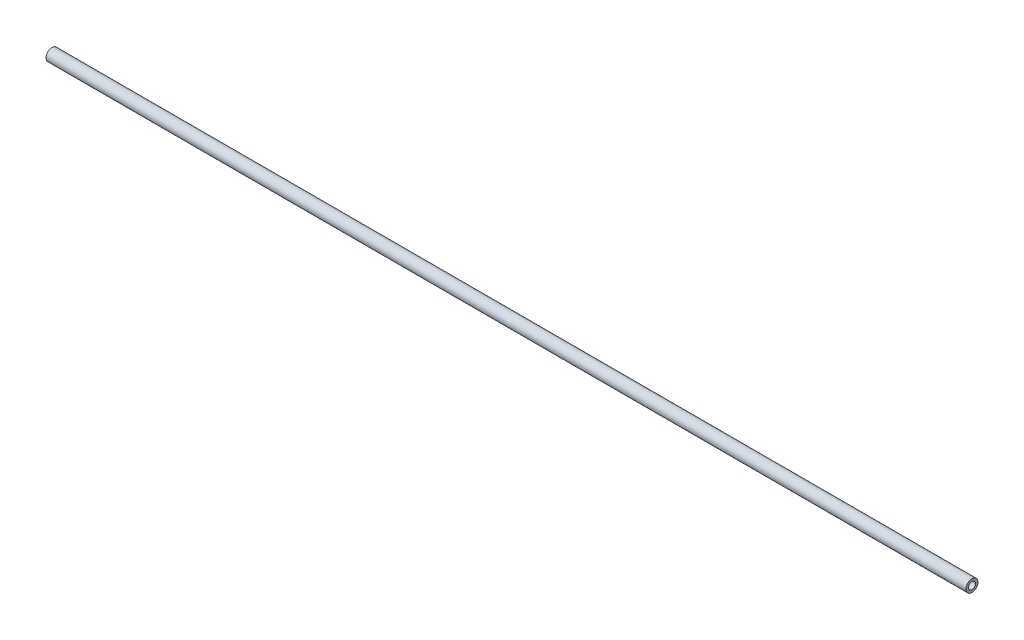
ISO-10303-21;
HEADER;
FILE_DESCRIPTION(('STEP AP214'),'2;1');
FILE_NAME('part.step','',(''),(''),'','','');
FILE_SCHEMA(('AUTOMOTIVE_DESIGN { 1 0 10303 214 1 1 1 1 }'));
ENDSEC;
DATA;
#1=APPLICATION_CONTEXT('core data for automotive mechanical design processes');
#2=APPLICATION_PROTOCOL_DEFINITION('international standard','automotive_design',2000,#1);
#3=PRODUCT_CONTEXT('',#1,'mechanical');
#4=PRODUCT('Part','Part','',(#3));
#5=PRODUCT_RELATED_PRODUCT_CATEGORY('part','',(#4));
#6=PRODUCT_DEFINITION_FORMATION('','',#4);
#7=PRODUCT_DEFINITION_CONTEXT('part definition',#1,'design');
#8=PRODUCT_DEFINITION('design','',#6,#7);
#9=PRODUCT_DEFINITION_SHAPE('','',#8);
#10=(LENGTH_UNIT() NAMED_UNIT(*) SI_UNIT(.MILLI.,.METRE.));
#11=(NAMED_UNIT(*) PLANE_ANGLE_UNIT() SI_UNIT($,.RADIAN.));
#12=(NAMED_UNIT(*) SI_UNIT($,.STERADIAN.) SOLID_ANGLE_UNIT());
#13=UNCERTAINTY_MEASURE_WITH_UNIT(LENGTH_MEASURE(1.E-05),#10,'distance_accuracy_value','');
#14=(GEOMETRIC_REPRESENTATION_CONTEXT(3) GLOBAL_UNCERTAINTY_ASSIGNED_CONTEXT((#13)) GLOBAL_UNIT_ASSIGNED_CONTEXT((#10,
#11,#12)) REPRESENTATION_CONTEXT('',''));
#15=CARTESIAN_POINT('',(0.,0.,0.));
#16=DIRECTION('',(0.,0.,1.));
#17=DIRECTION('',(1.,0.,0.));
#18=AXIS2_PLACEMENT_3D('',#15,#16,#17);
#19=CARTESIAN_POINT('',(152.4,0.,0.));
#20=DIRECTION('',(1.,0.,0.));
#21=DIRECTION('',(0.,0.,-1.));
#22=AXIS2_PLACEMENT_3D('',#19,#20,#21);
#23=PLANE('',#22);
#24=CARTESIAN_POINT('',(152.4,0.,0.));
#25=DIRECTION('',(1.,0.,0.));
#26=DIRECTION('',(0.,0.,-1.));
#27=AXIS2_PLACEMENT_3D('',#24,#25,#26);
#28=CIRCLE('',#27,1.984375);
#29=CARTESIAN_POINT('',(152.4,0.,1.984375));
#30=VERTEX_POINT('',#29);
#31=EDGE_CURVE('E10',#30,#30,#28,.T.);
#32=ORIENTED_EDGE('',*,*,#31,.T.);
#33=EDGE_LOOP('',(#32));
#34=FACE_BOUND('',#33,.T.);
#35=CARTESIAN_POINT('',(152.4,0.,0.));
#36=DIRECTION('',(1.,0.,0.));
#37=DIRECTION('',(0.,0.,-1.));
#38=AXIS2_PLACEMENT_3D('',#35,#36,#37);
#39=CIRCLE('',#38,1.190625);
#40=CARTESIAN_POINT('',(152.4,0.,1.190625));
#41=VERTEX_POINT('',#40);
#42=EDGE_CURVE('E41',#41,#41,#39,.T.);
#43=ORIENTED_EDGE('',*,*,#42,.F.);
#44=EDGE_LOOP('',(#43));
#45=FACE_BOUND('',#44,.T.);
#46=ADVANCED_FACE('F30',(#34,#45),#23,.T.);
#47=CARTESIAN_POINT('',(-152.4,0.,0.));
#48=DIRECTION('',(1.,0.,0.));
#49=DIRECTION('',(0.,0.,-1.));
#50=AXIS2_PLACEMENT_3D('',#47,#48,#49);
#51=PLANE('',#50);
#52=CARTESIAN_POINT('',(-152.4,0.,0.));
#53=DIRECTION('',(1.,0.,0.));
#54=DIRECTION('',(0.,0.,-1.));
#55=AXIS2_PLACEMENT_3D('',#52,#53,#54);
#56=CIRCLE('',#55,1.984375);
#57=CARTESIAN_POINT('',(-152.4,0.,1.984375));
#58=VERTEX_POINT('',#57);
#59=EDGE_CURVE('E34',#58,#58,#56,.T.);
#60=ORIENTED_EDGE('',*,*,#59,.F.);
#61=EDGE_LOOP('',(#60));
#62=FACE_BOUND('',#61,.T.);
#63=CARTESIAN_POINT('',(-152.4,0.,0.));
#64=DIRECTION('',(1.,0.,0.));
#65=DIRECTION('',(0.,0.,-1.));
#66=AXIS2_PLACEMENT_3D('',#63,#64,#65);
#67=CIRCLE('',#66,1.190625);
#68=CARTESIAN_POINT('',(-152.4,0.,1.190625));
#69=VERTEX_POINT('',#68);
#70=EDGE_CURVE('E43',#69,#69,#67,.T.);
#71=ORIENTED_EDGE('',*,*,#70,.T.);
#72=EDGE_LOOP('',(#71));
#73=FACE_BOUND('',#72,.T.);
#74=ADVANCED_FACE('F53',(#62,#73),#51,.F.);
#75=CARTESIAN_POINT('',(152.4,0.,0.));
#76=DIRECTION('',(-1.,0.,0.));
#77=DIRECTION('',(0.,0.,1.));
#78=AXIS2_PLACEMENT_3D('',#75,#76,#77);
#79=CYLINDRICAL_SURFACE('',#78,1.984375);
#80=CARTESIAN_POINT('',(152.4,0.,1.984375));
#81=CARTESIAN_POINT('',(149.225,0.,1.984375));
#82=CARTESIAN_POINT('',(146.05,0.,1.984375));
#83=CARTESIAN_POINT('',(139.7,0.,1.984375));
#84=CARTESIAN_POINT('',(136.525,0.,1.984375));
#85=CARTESIAN_POINT('',(130.175,0.,1.984375));
#86=CARTESIAN_POINT('',(127.,0.,1.984375));
#87=CARTESIAN_POINT('',(120.65,0.,1.984375));
#88=CARTESIAN_POINT('',(117.475,0.,1.984375));
#89=CARTESIAN_POINT('',(111.125,0.,1.984375));
#90=CARTESIAN_POINT('',(107.95,0.,1.984375));
#91=CARTESIAN_POINT('',(101.6,0.,1.984375));
#92=CARTESIAN_POINT('',(98.425,0.,1.984375));
#93=CARTESIAN_POINT('',(92.075,0.,1.984375));
#94=CARTESIAN_POINT('',(88.9,0.,1.984375));
#95=CARTESIAN_POINT('',(82.55,0.,1.984375));
#96=CARTESIAN_POINT('',(79.375,0.,1.984375));
#97=CARTESIAN_POINT('',(73.025,0.,1.984375));
#98=CARTESIAN_POINT('',(69.85,0.,1.984375));
#99=CARTESIAN_POINT('',(63.5,0.,1.984375));
#100=CARTESIAN_POINT('',(60.325,0.,1.984375));
#101=CARTESIAN_POINT('',(53.975,0.,1.984375));
#102=CARTESIAN_POINT('',(50.8,0.,1.984375));
#103=CARTESIAN_POINT('',(44.45,0.,1.984375));
#104=CARTESIAN_POINT('',(41.275,0.,1.984375));
#105=CARTESIAN_POINT('',(34.925,0.,1.984375));
#106=CARTESIAN_POINT('',(31.75,0.,1.984375));
#107=CARTESIAN_POINT('',(25.4,0.,1.984375));
#108=CARTESIAN_POINT('',(22.225,0.,1.984375));
#109=CARTESIAN_POINT('',(15.875,0.,1.984375));
#110=CARTESIAN_POINT('',(12.7,0.,1.984375));
#111=CARTESIAN_POINT('',(6.34999999999998,0.,1.984375));
#112=CARTESIAN_POINT('',(3.17499999999997,0.,1.984375));
#113=CARTESIAN_POINT('',(-3.17500000000003,0.,1.984375));
#114=CARTESIAN_POINT('',(-6.35000000000003,0.,1.984375));
#115=CARTESIAN_POINT('',(-12.7,0.,1.984375));
#116=CARTESIAN_POINT('',(-15.875,0.,1.984375));
#117=CARTESIAN_POINT('',(-22.225,0.,1.984375));
#118=CARTESIAN_POINT('',(-25.4,0.,1.984375));
#119=CARTESIAN_POINT('',(-31.75,0.,1.984375));
#120=CARTESIAN_POINT('',(-34.925,0.,1.984375));
#121=CARTESIAN_POINT('',(-41.275,0.,1.984375));
#122=CARTESIAN_POINT('',(-44.45,0.,1.984375));
#123=CARTESIAN_POINT('',(-50.8,0.,1.984375));
#124=CARTESIAN_POINT('',(-53.975,0.,1.984375));
#125=CARTESIAN_POINT('',(-60.325,0.,1.984375));
#126=CARTESIAN_POINT('',(-63.5,0.,1.984375));
#127=CARTESIAN_POINT('',(-69.85,0.,1.984375));
#128=CARTESIAN_POINT('',(-73.025,0.,1.984375));
#129=CARTESIAN_POINT('',(-79.375,0.,1.984375));
#130=CARTESIAN_POINT('',(-82.5500000000001,0.,1.984375));
#131=CARTESIAN_POINT('',(-88.9,0.,1.984375));
#132=CARTESIAN_POINT('',(-92.0750000000001,0.,1.984375));
#133=CARTESIAN_POINT('',(-98.425,0.,1.984375));
#134=CARTESIAN_POINT('',(-101.6,0.,1.984375));
#135=CARTESIAN_POINT('',(-107.95,0.,1.984375));
#136=CARTESIAN_POINT('',(-111.125,0.,1.984375));
#137=CARTESIAN_POINT('',(-117.475,0.,1.984375));
#138=CARTESIAN_POINT('',(-120.65,0.,1.984375));
#139=CARTESIAN_POINT('',(-127.,0.,1.984375));
#140=CARTESIAN_POINT('',(-130.175,0.,1.984375));
#141=CARTESIAN_POINT('',(-136.525,0.,1.984375));
#142=CARTESIAN_POINT('',(-139.7,0.,1.984375));
#143=CARTESIAN_POINT('',(-146.05,0.,1.984375));
#144=CARTESIAN_POINT('',(-149.225,0.,1.984375));
#145=CARTESIAN_POINT('',(-152.4,0.,1.984375));
#146=B_SPLINE_CURVE_WITH_KNOTS('',3,(#80,#81,#82,#83,#84,#85,#86,#87,#88,#89,#90,#91,#92,#93,
#94,#95,#96,#97,#98,#99,#100,#101,#102,#103,#104,#105,#106,#107,#108,#109,#110,#111,#112,#113,
#114,#115,#116,#117,#118,#119,#120,#121,#122,#123,#124,#125,#126,#127,#128,#129,#130,#131,#132,
#133,#134,#135,#136,#137,#138,#139,#140,#141,#142,#143,#144,#145),.UNSPECIFIED.,.F.,.F.,(4,2,2,
2,2,2,2,2,2,2,2,2,2,2,2,2,2,2,2,2,2,2,2,2,2,2,2,2,2,2,2,2,4),(0.,9.52499999999998,19.05,28.575,
38.1,47.625,57.15,66.675,76.2,85.725,95.25,104.775,114.3,123.825,133.35,142.875,152.4,161.925,
171.45,180.975,190.5,200.025,209.55,219.075,228.6,238.125,247.65,257.175,266.7,276.225,285.75,
295.275,304.8),.UNSPECIFIED.);
#147=EDGE_CURVE('BSEAM32',#30,#58,#146,.T.);
#148=ORIENTED_EDGE('',*,*,#31,.F.);
#149=ORIENTED_EDGE('',*,*,#59,.T.);
#150=ORIENTED_EDGE('',*,*,#147,.T.);
#151=ORIENTED_EDGE('',*,*,#147,.F.);
#152=EDGE_LOOP('',(#148,#150,#149,#151));
#153=FACE_BOUND('',#152,.T.);
#154=ADVANCED_FACE('F32',(#153),#79,.T.);
#155=CARTESIAN_POINT('',(152.4,0.,0.));
#156=DIRECTION('',(-1.,0.,0.));
#157=DIRECTION('',(0.,0.,1.));
#158=AXIS2_PLACEMENT_3D('',#155,#156,#157);
#159=CYLINDRICAL_SURFACE('',#158,1.190625);
#160=CARTESIAN_POINT('',(152.4,0.,1.190625));
#161=CARTESIAN_POINT('',(149.225,0.,1.190625));
#162=CARTESIAN_POINT('',(146.05,0.,1.190625));
#163=CARTESIAN_POINT('',(139.7,0.,1.190625));
#164=CARTESIAN_POINT('',(136.525,0.,1.190625));
#165=CARTESIAN_POINT('',(130.175,0.,1.190625));
#166=CARTESIAN_POINT('',(127.,0.,1.190625));
#167=CARTESIAN_POINT('',(120.65,0.,1.190625));
#168=CARTESIAN_POINT('',(117.475,0.,1.190625));
#169=CARTESIAN_POINT('',(111.125,0.,1.190625));
#170=CARTESIAN_POINT('',(107.95,0.,1.190625));
#171=CARTESIAN_POINT('',(101.6,0.,1.190625));
#172=CARTESIAN_POINT('',(98.425,0.,1.190625));
#173=CARTESIAN_POINT('',(92.075,0.,1.190625));
#174=CARTESIAN_POINT('',(88.9,0.,1.190625));
#175=CARTESIAN_POINT('',(82.55,0.,1.190625));
#176=CARTESIAN_POINT('',(79.375,0.,1.190625));
#177=CARTESIAN_POINT('',(73.025,0.,1.190625));
#178=CARTESIAN_POINT('',(69.85,0.,1.190625));
#179=CARTESIAN_POINT('',(63.5,0.,1.190625));
#180=CARTESIAN_POINT('',(60.325,0.,1.190625));
#181=CARTESIAN_POINT('',(53.975,0.,1.190625));
#182=CARTESIAN_POINT('',(50.8,0.,1.190625));
#183=CARTESIAN_POINT('',(44.45,0.,1.190625));
#184=CARTESIAN_POINT('',(41.275,0.,1.190625));
#185=CARTESIAN_POINT('',(34.925,0.,1.190625));
#186=CARTESIAN_POINT('',(31.75,0.,1.190625));
#187=CARTESIAN_POINT('',(25.4,0.,1.190625));
#188=CARTESIAN_POINT('',(22.225,0.,1.190625));
#189=CARTESIAN_POINT('',(15.875,0.,1.190625));
#190=CARTESIAN_POINT('',(12.7,0.,1.190625));
#191=CARTESIAN_POINT('',(6.34999999999998,0.,1.190625));
#192=CARTESIAN_POINT('',(3.17499999999997,0.,1.190625));
#193=CARTESIAN_POINT('',(-3.17500000000003,0.,1.190625));
#194=CARTESIAN_POINT('',(-6.35000000000003,0.,1.190625));
#195=CARTESIAN_POINT('',(-12.7,0.,1.190625));
#196=CARTESIAN_POINT('',(-15.875,0.,1.190625));
#197=CARTESIAN_POINT('',(-22.225,0.,1.190625));
#198=CARTESIAN_POINT('',(-25.4,0.,1.190625));
#199=CARTESIAN_POINT('',(-31.75,0.,1.190625));
#200=CARTESIAN_POINT('',(-34.925,0.,1.190625));
#201=CARTESIAN_POINT('',(-41.275,0.,1.190625));
#202=CARTESIAN_POINT('',(-44.45,0.,1.190625));
#203=CARTESIAN_POINT('',(-50.8,0.,1.190625));
#204=CARTESIAN_POINT('',(-53.975,0.,1.190625));
#205=CARTESIAN_POINT('',(-60.325,0.,1.190625));
#206=CARTESIAN_POINT('',(-63.5,0.,1.190625));
#207=CARTESIAN_POINT('',(-69.85,0.,1.190625));
#208=CARTESIAN_POINT('',(-73.025,0.,1.190625));
#209=CARTESIAN_POINT('',(-79.375,0.,1.190625));
#210=CARTESIAN_POINT('',(-82.5500000000001,0.,1.190625));
#211=CARTESIAN_POINT('',(-88.9,0.,1.190625));
#212=CARTESIAN_POINT('',(-92.0750000000001,0.,1.190625));
#213=CARTESIAN_POINT('',(-98.425,0.,1.190625));
#214=CARTESIAN_POINT('',(-101.6,0.,1.190625));
#215=CARTESIAN_POINT('',(-107.95,0.,1.190625));
#216=CARTESIAN_POINT('',(-111.125,0.,1.190625));
#217=CARTESIAN_POINT('',(-117.475,0.,1.190625));
#218=CARTESIAN_POINT('',(-120.65,0.,1.190625));
#219=CARTESIAN_POINT('',(-127.,0.,1.190625));
#220=CARTESIAN_POINT('',(-130.175,0.,1.190625));
#221=CARTESIAN_POINT('',(-136.525,0.,1.190625));
#222=CARTESIAN_POINT('',(-139.7,0.,1.190625));
#223=CARTESIAN_POINT('',(-146.05,0.,1.190625));
#224=CARTESIAN_POINT('',(-149.225,0.,1.190625));
#225=CARTESIAN_POINT('',(-152.4,0.,1.190625));
#226=B_SPLINE_CURVE_WITH_KNOTS('',3,(#160,#161,#162,#163,#164,#165,#166,#167,#168,#169,#170,
#171,#172,#173,#174,#175,#176,#177,#178,#179,#180,#181,#182,#183,#184,#185,#186,#187,#188,#189,
#190,#191,#192,#193,#194,#195,#196,#197,#198,#199,#200,#201,#202,#203,#204,#205,#206,#207,#208,
#209,#210,#211,#212,#213,#214,#215,#216,#217,#218,#219,#220,#221,#222,#223,#224,#225),
.UNSPECIFIED.,.F.,.F.,(4,2,2,2,2,2,2,2,2,2,2,2,2,2,2,2,2,2,2,2,2,2,2,2,2,2,2,2,2,2,2,2,4),(0.,
9.52499999999998,19.05,28.575,38.1,47.625,57.15,66.675,76.2,85.725,95.25,104.775,114.3,123.825,
133.35,142.875,152.4,161.925,171.45,180.975,190.5,200.025,209.55,219.075,228.6,238.125,247.65,
257.175,266.7,276.225,285.75,295.275,304.8),.UNSPECIFIED.);
#227=EDGE_CURVE('BSEAM49',#41,#69,#226,.T.);
#228=ORIENTED_EDGE('',*,*,#42,.T.);
#229=ORIENTED_EDGE('',*,*,#70,.F.);
#230=ORIENTED_EDGE('',*,*,#227,.T.);
#231=ORIENTED_EDGE('',*,*,#227,.F.);
#232=EDGE_LOOP('',(#228,#230,#229,#231));
#233=FACE_BOUND('',#232,.T.);
#234=ADVANCED_FACE('F49',(#233),#159,.F.);
#235=CLOSED_SHELL('',(#46,#74,#154,#234));
#236=MANIFOLD_SOLID_BREP('B2',#235);
#237=ADVANCED_BREP_SHAPE_REPRESENTATION('',(#18,#236),#14);
#238=SHAPE_DEFINITION_REPRESENTATION(#9,#237);
ENDSEC;
END-ISO-10303-21;
